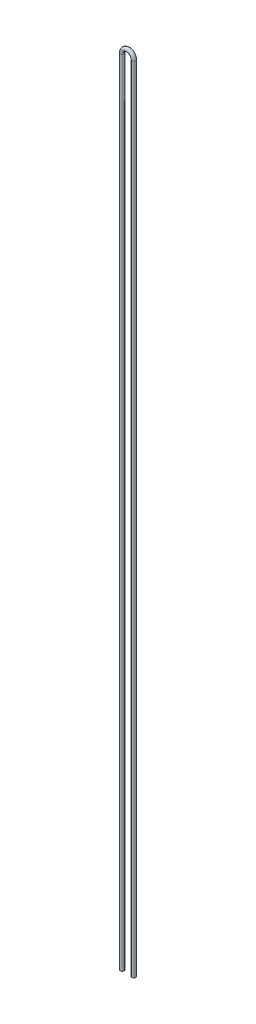
ISO-10303-21;
HEADER;
FILE_DESCRIPTION(('STEP AP214'),'2;1');
FILE_NAME('part.step','',(''),(''),'','','');
FILE_SCHEMA(('AUTOMOTIVE_DESIGN { 1 0 10303 214 1 1 1 1 }'));
ENDSEC;
DATA;
#1=APPLICATION_CONTEXT('core data for automotive mechanical design processes');
#2=APPLICATION_PROTOCOL_DEFINITION('international standard','automotive_design',2000,#1);
#3=PRODUCT_CONTEXT('',#1,'mechanical');
#4=PRODUCT('Part','Part','',(#3));
#5=PRODUCT_RELATED_PRODUCT_CATEGORY('part','',(#4));
#6=PRODUCT_DEFINITION_FORMATION('','',#4);
#7=PRODUCT_DEFINITION_CONTEXT('part definition',#1,'design');
#8=PRODUCT_DEFINITION('design','',#6,#7);
#9=PRODUCT_DEFINITION_SHAPE('','',#8);
#10=(LENGTH_UNIT() NAMED_UNIT(*) SI_UNIT(.MILLI.,.METRE.));
#11=(NAMED_UNIT(*) PLANE_ANGLE_UNIT() SI_UNIT($,.RADIAN.));
#12=(NAMED_UNIT(*) SI_UNIT($,.STERADIAN.) SOLID_ANGLE_UNIT());
#13=UNCERTAINTY_MEASURE_WITH_UNIT(LENGTH_MEASURE(1.E-05),#10,'distance_accuracy_value','');
#14=(GEOMETRIC_REPRESENTATION_CONTEXT(3) GLOBAL_UNCERTAINTY_ASSIGNED_CONTEXT((#13)) GLOBAL_UNIT_ASSIGNED_CONTEXT((#10,
#11,#12)) REPRESENTATION_CONTEXT('',''));
#15=CARTESIAN_POINT('',(0.,0.,0.));
#16=DIRECTION('',(0.,0.,1.));
#17=DIRECTION('',(1.,0.,0.));
#18=AXIS2_PLACEMENT_3D('',#15,#16,#17);
#19=CARTESIAN_POINT('',(0.15,0.,0.));
#20=DIRECTION('',(0.,1.,0.));
#21=DIRECTION('',(0.,0.,1.));
#22=AXIS2_PLACEMENT_3D('',#19,#20,#21);
#23=PLANE('',#22);
#24=CARTESIAN_POINT('',(0.15,0.,0.));
#25=DIRECTION('',(0.,1.,0.));
#26=DIRECTION('',(0.,0.,1.));
#27=AXIS2_PLACEMENT_3D('',#24,#25,#26);
#28=CIRCLE('',#27,0.0500000000000006);
#29=CARTESIAN_POINT('',(0.15,0.,0.0500000000000006));
#30=VERTEX_POINT('',#29);
#31=EDGE_CURVE('E45',#30,#30,#28,.T.);
#32=ORIENTED_EDGE('',*,*,#31,.F.);
#33=EDGE_LOOP('',(#32));
#34=FACE_BOUND('',#33,.T.);
#35=ADVANCED_FACE('F31',(#34),#23,.F.);
#36=CARTESIAN_POINT('',(-0.15,0.,0.));
#37=DIRECTION('',(0.,-1.,0.));
#38=DIRECTION('',(0.,0.,1.));
#39=AXIS2_PLACEMENT_3D('',#36,#37,#38);
#40=PLANE('',#39);
#41=CARTESIAN_POINT('',(-0.15,0.,0.));
#42=DIRECTION('',(0.,-1.,0.));
#43=DIRECTION('',(0.,0.,1.));
#44=AXIS2_PLACEMENT_3D('',#41,#42,#43);
#45=CIRCLE('',#44,0.0500000000000006);
#46=CARTESIAN_POINT('',(-0.15,0.,0.0500000000000006));
#47=VERTEX_POINT('',#46);
#48=EDGE_CURVE('E10',#47,#47,#45,.T.);
#49=ORIENTED_EDGE('',*,*,#48,.T.);
#50=EDGE_LOOP('',(#49));
#51=FACE_BOUND('',#50,.T.);
#52=ADVANCED_FACE('F54',(#51),#40,.T.);
#53=CARTESIAN_POINT('',(0.15,0.,0.));
#54=DIRECTION('',(0.,1.,0.));
#55=DIRECTION('',(0.,0.,1.));
#56=AXIS2_PLACEMENT_3D('',#53,#54,#55);
#57=CYLINDRICAL_SURFACE('',#56,0.0500000000000006);
#58=CARTESIAN_POINT('',(0.15,20.5,0.));
#59=DIRECTION('',(0.,1.,0.));
#60=DIRECTION('',(0.,0.,1.));
#61=AXIS2_PLACEMENT_3D('',#58,#59,#60);
#62=CIRCLE('',#61,0.0500000000000006);
#63=CARTESIAN_POINT('',(0.200000000000001,20.5,0.));
#64=VERTEX_POINT('',#63);
#65=EDGE_CURVE('E41',#64,#64,#62,.T.);
#66=ORIENTED_EDGE('',*,*,#65,.F.);
#67=EDGE_LOOP('',(#66));
#68=FACE_BOUND('',#67,.T.);
#69=ORIENTED_EDGE('',*,*,#31,.T.);
#70=EDGE_LOOP('',(#69));
#71=FACE_BOUND('',#70,.T.);
#72=ADVANCED_FACE('F51',(#68,#71),#57,.T.);
#73=CARTESIAN_POINT('',(0.,20.5,0.));
#74=DIRECTION('',(0.,0.,1.));
#75=DIRECTION('',(1.,0.,0.));
#76=AXIS2_PLACEMENT_3D('',#73,#74,#75);
#77=TOROIDAL_SURFACE('',#76,0.15,0.0500000000000006);
#78=CARTESIAN_POINT('',(-0.15,20.5,0.));
#79=DIRECTION('',(0.,-1.,0.));
#80=DIRECTION('',(0.,0.,1.));
#81=AXIS2_PLACEMENT_3D('',#78,#79,#80);
#82=CIRCLE('',#81,0.0500000000000006);
#83=CARTESIAN_POINT('',(-0.200000000000001,20.5,0.));
#84=VERTEX_POINT('',#83);
#85=EDGE_CURVE('E37',#84,#84,#82,.T.);
#86=CARTESIAN_POINT('',(0.,20.5,0.));
#87=DIRECTION('',(0.,0.,1.));
#88=DIRECTION('',(1.,0.,0.));
#89=AXIS2_PLACEMENT_3D('',#86,#87,#88);
#90=CIRCLE('',#89,0.200000000000001);
#91=EDGE_CURVE('',#64,#84,#90,.T.);
#92=ORIENTED_EDGE('',*,*,#65,.T.);
#93=ORIENTED_EDGE('',*,*,#85,.F.);
#94=ORIENTED_EDGE('',*,*,#91,.T.);
#95=ORIENTED_EDGE('',*,*,#91,.F.);
#96=EDGE_LOOP('',(#92,#94,#93,#95));
#97=FACE_BOUND('',#96,.T.);
#98=ADVANCED_FACE('F60',(#97),#77,.T.);
#99=CARTESIAN_POINT('',(-0.15,20.5,0.));
#100=DIRECTION('',(0.,-1.,0.));
#101=DIRECTION('',(0.,0.,-1.));
#102=AXIS2_PLACEMENT_3D('',#99,#100,#101);
#103=CYLINDRICAL_SURFACE('',#102,0.0500000000000006);
#104=ORIENTED_EDGE('',*,*,#48,.F.);
#105=EDGE_LOOP('',(#104));
#106=FACE_BOUND('',#105,.T.);
#107=ORIENTED_EDGE('',*,*,#85,.T.);
#108=EDGE_LOOP('',(#107));
#109=FACE_BOUND('',#108,.T.);
#110=ADVANCED_FACE('F58',(#106,#109),#103,.T.);
#111=CLOSED_SHELL('',(#35,#52,#72,#98,#110));
#112=MANIFOLD_SOLID_BREP('B2',#111);
#113=ADVANCED_BREP_SHAPE_REPRESENTATION('',(#18,#112),#14);
#114=SHAPE_DEFINITION_REPRESENTATION(#9,#113);
ENDSEC;
END-ISO-10303-21;
